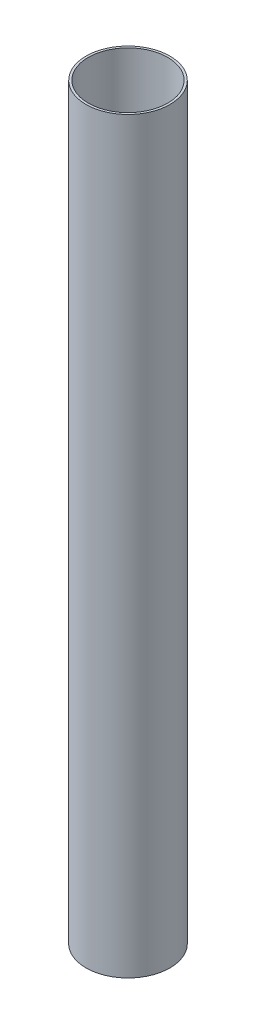
ISO-10303-21;
HEADER;
FILE_DESCRIPTION(('STEP AP214'),'2;1');
FILE_NAME('part.step','',(''),(''),'','','');
FILE_SCHEMA(('AUTOMOTIVE_DESIGN { 1 0 10303 214 1 1 1 1 }'));
ENDSEC;
DATA;
#1=APPLICATION_CONTEXT('core data for automotive mechanical design processes');
#2=APPLICATION_PROTOCOL_DEFINITION('international standard','automotive_design',2000,#1);
#3=PRODUCT_CONTEXT('',#1,'mechanical');
#4=PRODUCT('Part','Part','',(#3));
#5=PRODUCT_RELATED_PRODUCT_CATEGORY('part','',(#4));
#6=PRODUCT_DEFINITION_FORMATION('','',#4);
#7=PRODUCT_DEFINITION_CONTEXT('part definition',#1,'design');
#8=PRODUCT_DEFINITION('design','',#6,#7);
#9=PRODUCT_DEFINITION_SHAPE('','',#8);
#10=(LENGTH_UNIT() NAMED_UNIT(*) SI_UNIT(.MILLI.,.METRE.));
#11=(NAMED_UNIT(*) PLANE_ANGLE_UNIT() SI_UNIT($,.RADIAN.));
#12=(NAMED_UNIT(*) SI_UNIT($,.STERADIAN.) SOLID_ANGLE_UNIT());
#13=UNCERTAINTY_MEASURE_WITH_UNIT(LENGTH_MEASURE(1.E-05),#10,'distance_accuracy_value','');
#14=(GEOMETRIC_REPRESENTATION_CONTEXT(3) GLOBAL_UNCERTAINTY_ASSIGNED_CONTEXT((#13)) GLOBAL_UNIT_ASSIGNED_CONTEXT((#10,
#11,#12)) REPRESENTATION_CONTEXT('',''));
#15=CARTESIAN_POINT('',(0.,0.,0.));
#16=DIRECTION('',(0.,0.,1.));
#17=DIRECTION('',(1.,0.,0.));
#18=AXIS2_PLACEMENT_3D('',#15,#16,#17);
#19=CARTESIAN_POINT('',(0.,123.620053705202,0.));
#20=DIRECTION('',(0.,1.,0.));
#21=DIRECTION('',(0.,0.,1.));
#22=AXIS2_PLACEMENT_3D('',#19,#20,#21);
#23=CYLINDRICAL_SURFACE('',#22,28.4988);
#24=CARTESIAN_POINT('',(0.,508.,0.));
#25=DIRECTION('',(0.,1.,0.));
#26=DIRECTION('',(0.,0.,1.));
#27=AXIS2_PLACEMENT_3D('',#24,#25,#26);
#28=CIRCLE('',#27,28.4988);
#29=CARTESIAN_POINT('',(0.,508.,28.4988));
#30=VERTEX_POINT('',#29);
#31=EDGE_CURVE('E10',#30,#30,#28,.T.);
#32=ORIENTED_EDGE('',*,*,#31,.F.);
#33=EDGE_LOOP('',(#32));
#34=FACE_BOUND('',#33,.T.);
#35=CARTESIAN_POINT('',(0.,0.,0.));
#36=DIRECTION('',(0.,1.,0.));
#37=DIRECTION('',(0.,0.,1.));
#38=AXIS2_PLACEMENT_3D('',#35,#36,#37);
#39=CIRCLE('',#38,28.4988);
#40=CARTESIAN_POINT('',(0.,0.,28.4988));
#41=VERTEX_POINT('',#40);
#42=EDGE_CURVE('E49',#41,#41,#39,.T.);
#43=ORIENTED_EDGE('',*,*,#42,.T.);
#44=EDGE_LOOP('',(#43));
#45=FACE_BOUND('',#44,.T.);
#46=ADVANCED_FACE('F35',(#34,#45),#23,.T.);
#47=CARTESIAN_POINT('',(28.4988,508.,0.));
#48=DIRECTION('',(0.,-1.,0.));
#49=DIRECTION('',(0.,0.,-1.));
#50=AXIS2_PLACEMENT_3D('',#47,#48,#49);
#51=PLANE('',#50);
#52=CARTESIAN_POINT('',(0.,508.,0.));
#53=DIRECTION('',(0.,1.,0.));
#54=DIRECTION('',(0.,0.,1.));
#55=AXIS2_PLACEMENT_3D('',#52,#53,#54);
#56=CIRCLE('',#55,26.9748);
#57=CARTESIAN_POINT('',(0.,508.,26.9748));
#58=VERTEX_POINT('',#57);
#59=EDGE_CURVE('E41',#58,#58,#56,.T.);
#60=ORIENTED_EDGE('',*,*,#59,.F.);
#61=EDGE_LOOP('',(#60));
#62=FACE_BOUND('',#61,.T.);
#63=ORIENTED_EDGE('',*,*,#31,.T.);
#64=EDGE_LOOP('',(#63));
#65=FACE_BOUND('',#64,.T.);
#66=ADVANCED_FACE('F64',(#62,#65),#51,.F.);
#67=CARTESIAN_POINT('',(0.,123.620053705202,0.));
#68=DIRECTION('',(0.,1.,0.));
#69=DIRECTION('',(0.,0.,1.));
#70=AXIS2_PLACEMENT_3D('',#67,#68,#69);
#71=CYLINDRICAL_SURFACE('',#70,26.9748);
#72=CARTESIAN_POINT('',(0.,0.,0.));
#73=DIRECTION('',(0.,1.,0.));
#74=DIRECTION('',(0.,0.,1.));
#75=AXIS2_PLACEMENT_3D('',#72,#73,#74);
#76=CIRCLE('',#75,26.9748);
#77=CARTESIAN_POINT('',(0.,0.,26.9748));
#78=VERTEX_POINT('',#77);
#79=EDGE_CURVE('E45',#78,#78,#76,.T.);
#80=ORIENTED_EDGE('',*,*,#79,.F.);
#81=EDGE_LOOP('',(#80));
#82=FACE_BOUND('',#81,.T.);
#83=ORIENTED_EDGE('',*,*,#59,.T.);
#84=EDGE_LOOP('',(#83));
#85=FACE_BOUND('',#84,.T.);
#86=ADVANCED_FACE('F59',(#82,#85),#71,.F.);
#87=CARTESIAN_POINT('',(26.9748,0.,0.));
#88=DIRECTION('',(0.,1.,0.));
#89=DIRECTION('',(0.,0.,1.));
#90=AXIS2_PLACEMENT_3D('',#87,#88,#89);
#91=PLANE('',#90);
#92=ORIENTED_EDGE('',*,*,#42,.F.);
#93=EDGE_LOOP('',(#92));
#94=FACE_BOUND('',#93,.T.);
#95=ORIENTED_EDGE('',*,*,#79,.T.);
#96=EDGE_LOOP('',(#95));
#97=FACE_BOUND('',#96,.T.);
#98=ADVANCED_FACE('F56',(#94,#97),#91,.F.);
#99=CLOSED_SHELL('',(#46,#66,#86,#98));
#100=MANIFOLD_SOLID_BREP('B2',#99);
#101=ADVANCED_BREP_SHAPE_REPRESENTATION('',(#18,#100),#14);
#102=SHAPE_DEFINITION_REPRESENTATION(#9,#101);
ENDSEC;
END-ISO-10303-21;
